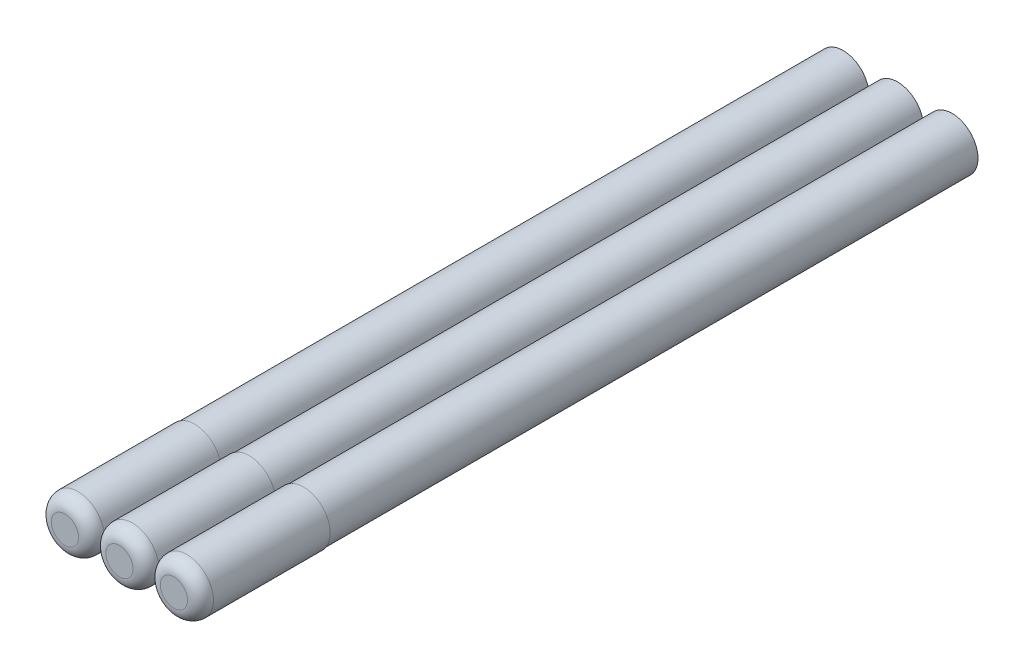
ISO-10303-21;
HEADER;
FILE_DESCRIPTION(('STEP AP214'),'2;1');
FILE_NAME('part.step','',(''),(''),'','','');
FILE_SCHEMA(('AUTOMOTIVE_DESIGN { 1 0 10303 214 1 1 1 1 }'));
ENDSEC;
DATA;
#1=APPLICATION_CONTEXT('core data for automotive mechanical design processes');
#2=APPLICATION_PROTOCOL_DEFINITION('international standard','automotive_design',2000,#1);
#3=PRODUCT_CONTEXT('',#1,'mechanical');
#4=PRODUCT('Part','Part','',(#3));
#5=PRODUCT_RELATED_PRODUCT_CATEGORY('part','',(#4));
#6=PRODUCT_DEFINITION_FORMATION('','',#4);
#7=PRODUCT_DEFINITION_CONTEXT('part definition',#1,'design');
#8=PRODUCT_DEFINITION('design','',#6,#7);
#9=PRODUCT_DEFINITION_SHAPE('','',#8);
#10=(LENGTH_UNIT() NAMED_UNIT(*) SI_UNIT(.MILLI.,.METRE.));
#11=(NAMED_UNIT(*) PLANE_ANGLE_UNIT() SI_UNIT($,.RADIAN.));
#12=(NAMED_UNIT(*) SI_UNIT($,.STERADIAN.) SOLID_ANGLE_UNIT());
#13=UNCERTAINTY_MEASURE_WITH_UNIT(LENGTH_MEASURE(1.E-05),#10,'distance_accuracy_value','');
#14=(GEOMETRIC_REPRESENTATION_CONTEXT(3) GLOBAL_UNCERTAINTY_ASSIGNED_CONTEXT((#13)) GLOBAL_UNIT_ASSIGNED_CONTEXT((#10,
#11,#12)) REPRESENTATION_CONTEXT('',''));
#15=CARTESIAN_POINT('',(0.,0.,0.));
#16=DIRECTION('',(0.,0.,1.));
#17=DIRECTION('',(1.,0.,0.));
#18=AXIS2_PLACEMENT_3D('',#15,#16,#17);
#19=CARTESIAN_POINT('',(-4.2,0.,60.));
#20=DIRECTION('',(0.,0.,-1.));
#21=DIRECTION('',(-1.,0.,0.));
#22=AXIS2_PLACEMENT_3D('',#19,#20,#21);
#23=CYLINDRICAL_SURFACE('',#22,2.05);
#24=CARTESIAN_POINT('',(-4.2,0.,59.));
#25=DIRECTION('',(0.,0.,1.));
#26=DIRECTION('',(1.,0.,0.));
#27=AXIS2_PLACEMENT_3D('',#24,#25,#26);
#28=CIRCLE('',#27,2.05);
#29=CARTESIAN_POINT('',(-2.15,0.,59.));
#30=VERTEX_POINT('',#29);
#31=EDGE_CURVE('E11',#30,#30,#28,.F.);
#32=ORIENTED_EDGE('',*,*,#31,.T.);
#33=EDGE_LOOP('',(#32));
#34=FACE_BOUND('',#33,.T.);
#35=CARTESIAN_POINT('',(-4.2,0.,50.));
#36=DIRECTION('',(0.,0.,1.));
#37=DIRECTION('',(1.,0.,0.));
#38=AXIS2_PLACEMENT_3D('',#35,#36,#37);
#39=CIRCLE('',#38,2.05);
#40=CARTESIAN_POINT('',(-2.15,0.,50.));
#41=VERTEX_POINT('',#40);
#42=EDGE_CURVE('E53',#41,#41,#39,.T.);
#43=ORIENTED_EDGE('',*,*,#42,.T.);
#44=EDGE_LOOP('',(#43));
#45=FACE_BOUND('',#44,.T.);
#46=ADVANCED_FACE('F42',(#34,#45),#23,.T.);
#47=CARTESIAN_POINT('',(-4.2,0.,60.));
#48=DIRECTION('',(0.,0.,1.));
#49=DIRECTION('',(1.,0.,0.));
#50=AXIS2_PLACEMENT_3D('',#47,#48,#49);
#51=PLANE('',#50);
#52=CARTESIAN_POINT('',(-4.2,0.,60.));
#53=DIRECTION('',(0.,0.,1.));
#54=DIRECTION('',(1.,0.,0.));
#55=AXIS2_PLACEMENT_3D('',#52,#53,#54);
#56=CIRCLE('',#55,1.05);
#57=CARTESIAN_POINT('',(-3.15,0.,60.));
#58=VERTEX_POINT('',#57);
#59=EDGE_CURVE('E49',#58,#58,#56,.T.);
#60=ORIENTED_EDGE('',*,*,#59,.T.);
#61=EDGE_LOOP('',(#60));
#62=FACE_BOUND('',#61,.T.);
#63=ADVANCED_FACE('F63',(#62),#51,.T.);
#64=CARTESIAN_POINT('',(-4.2,0.,50.));
#65=DIRECTION('',(0.,0.,1.));
#66=DIRECTION('',(1.,0.,0.));
#67=AXIS2_PLACEMENT_3D('',#64,#65,#66);
#68=PLANE('',#67);
#69=ORIENTED_EDGE('',*,*,#42,.F.);
#70=EDGE_LOOP('',(#69));
#71=FACE_BOUND('',#70,.T.);
#72=ADVANCED_FACE('F61',(#71),#68,.F.);
#73=CARTESIAN_POINT('',(-4.2,0.,59.));
#74=DIRECTION('',(0.,0.,1.));
#75=DIRECTION('',(1.,0.,0.));
#76=AXIS2_PLACEMENT_3D('',#73,#74,#75);
#77=TOROIDAL_SURFACE('',#76,1.05,1.);
#78=ORIENTED_EDGE('',*,*,#31,.F.);
#79=EDGE_LOOP('',(#78));
#80=FACE_BOUND('',#79,.T.);
#81=ORIENTED_EDGE('',*,*,#59,.F.);
#82=EDGE_LOOP('',(#81));
#83=FACE_BOUND('',#82,.T.);
#84=ADVANCED_FACE('F44',(#80,#83),#77,.T.);
#85=CLOSED_SHELL('',(#46,#63,#72,#84));
#86=MANIFOLD_SOLID_BREP('B2',#85);
#87=CARTESIAN_POINT('',(4.2,0.,60.));
#88=DIRECTION('',(0.,0.,-1.));
#89=DIRECTION('',(-1.,0.,0.));
#90=AXIS2_PLACEMENT_3D('',#87,#88,#89);
#91=CYLINDRICAL_SURFACE('',#90,2.05);
#92=CARTESIAN_POINT('',(4.2,0.,59.));
#93=DIRECTION('',(0.,0.,1.));
#94=DIRECTION('',(1.,0.,0.));
#95=AXIS2_PLACEMENT_3D('',#92,#93,#94);
#96=CIRCLE('',#95,2.05);
#97=CARTESIAN_POINT('',(6.25,0.,59.));
#98=VERTEX_POINT('',#97);
#99=EDGE_CURVE('E41',#98,#98,#96,.F.);
#100=ORIENTED_EDGE('',*,*,#99,.T.);
#101=EDGE_LOOP('',(#100));
#102=FACE_BOUND('',#101,.T.);
#103=CARTESIAN_POINT('',(4.2,0.,50.));
#104=DIRECTION('',(0.,0.,1.));
#105=DIRECTION('',(1.,0.,0.));
#106=AXIS2_PLACEMENT_3D('',#103,#104,#105);
#107=CIRCLE('',#106,2.05);
#108=CARTESIAN_POINT('',(6.25,0.,50.));
#109=VERTEX_POINT('',#108);
#110=EDGE_CURVE('E117',#109,#109,#107,.T.);
#111=ORIENTED_EDGE('',*,*,#110,.T.);
#112=EDGE_LOOP('',(#111));
#113=FACE_BOUND('',#112,.T.);
#114=ADVANCED_FACE('F106',(#102,#113),#91,.T.);
#115=CARTESIAN_POINT('',(4.2,0.,60.));
#116=DIRECTION('',(0.,0.,1.));
#117=DIRECTION('',(1.,0.,0.));
#118=AXIS2_PLACEMENT_3D('',#115,#116,#117);
#119=PLANE('',#118);
#120=CARTESIAN_POINT('',(4.2,0.,60.));
#121=DIRECTION('',(0.,0.,1.));
#122=DIRECTION('',(1.,0.,0.));
#123=AXIS2_PLACEMENT_3D('',#120,#121,#122);
#124=CIRCLE('',#123,1.05);
#125=CARTESIAN_POINT('',(5.25,0.,60.));
#126=VERTEX_POINT('',#125);
#127=EDGE_CURVE('E113',#126,#126,#124,.T.);
#128=ORIENTED_EDGE('',*,*,#127,.T.);
#129=EDGE_LOOP('',(#128));
#130=FACE_BOUND('',#129,.T.);
#131=ADVANCED_FACE('F127',(#130),#119,.T.);
#132=CARTESIAN_POINT('',(4.2,0.,50.));
#133=DIRECTION('',(0.,0.,1.));
#134=DIRECTION('',(1.,0.,0.));
#135=AXIS2_PLACEMENT_3D('',#132,#133,#134);
#136=PLANE('',#135);
#137=ORIENTED_EDGE('',*,*,#110,.F.);
#138=EDGE_LOOP('',(#137));
#139=FACE_BOUND('',#138,.T.);
#140=ADVANCED_FACE('F125',(#139),#136,.F.);
#141=CARTESIAN_POINT('',(4.2,0.,59.));
#142=DIRECTION('',(0.,0.,1.));
#143=DIRECTION('',(1.,0.,0.));
#144=AXIS2_PLACEMENT_3D('',#141,#142,#143);
#145=TOROIDAL_SURFACE('',#144,1.05,1.);
#146=ORIENTED_EDGE('',*,*,#99,.F.);
#147=EDGE_LOOP('',(#146));
#148=FACE_BOUND('',#147,.T.);
#149=ORIENTED_EDGE('',*,*,#127,.F.);
#150=EDGE_LOOP('',(#149));
#151=FACE_BOUND('',#150,.T.);
#152=ADVANCED_FACE('F108',(#148,#151),#145,.T.);
#153=CLOSED_SHELL('',(#114,#131,#140,#152));
#154=MANIFOLD_SOLID_BREP('B6',#153);
#155=CARTESIAN_POINT('',(0.,0.,60.));
#156=DIRECTION('',(0.,0.,-1.));
#157=DIRECTION('',(-1.,0.,0.));
#158=AXIS2_PLACEMENT_3D('',#155,#156,#157);
#159=CYLINDRICAL_SURFACE('',#158,2.05);
#160=CARTESIAN_POINT('',(0.,0.,59.));
#161=DIRECTION('',(0.,0.,1.));
#162=DIRECTION('',(1.,0.,0.));
#163=AXIS2_PLACEMENT_3D('',#160,#161,#162);
#164=CIRCLE('',#163,2.05);
#165=CARTESIAN_POINT('',(2.05,0.,59.));
#166=VERTEX_POINT('',#165);
#167=EDGE_CURVE('E105',#166,#166,#164,.F.);
#168=ORIENTED_EDGE('',*,*,#167,.T.);
#169=EDGE_LOOP('',(#168));
#170=FACE_BOUND('',#169,.T.);
#171=CARTESIAN_POINT('',(0.,0.,50.));
#172=DIRECTION('',(0.,0.,1.));
#173=DIRECTION('',(1.,0.,0.));
#174=AXIS2_PLACEMENT_3D('',#171,#172,#173);
#175=CIRCLE('',#174,2.05);
#176=CARTESIAN_POINT('',(2.05,0.,50.));
#177=VERTEX_POINT('',#176);
#178=EDGE_CURVE('E181',#177,#177,#175,.T.);
#179=ORIENTED_EDGE('',*,*,#178,.T.);
#180=EDGE_LOOP('',(#179));
#181=FACE_BOUND('',#180,.T.);
#182=ADVANCED_FACE('F170',(#170,#181),#159,.T.);
#183=CARTESIAN_POINT('',(0.,0.,60.));
#184=DIRECTION('',(0.,0.,1.));
#185=DIRECTION('',(1.,0.,0.));
#186=AXIS2_PLACEMENT_3D('',#183,#184,#185);
#187=PLANE('',#186);
#188=CARTESIAN_POINT('',(0.,0.,60.));
#189=DIRECTION('',(0.,0.,1.));
#190=DIRECTION('',(1.,0.,0.));
#191=AXIS2_PLACEMENT_3D('',#188,#189,#190);
#192=CIRCLE('',#191,1.05);
#193=CARTESIAN_POINT('',(1.05,0.,60.));
#194=VERTEX_POINT('',#193);
#195=EDGE_CURVE('E177',#194,#194,#192,.T.);
#196=ORIENTED_EDGE('',*,*,#195,.T.);
#197=EDGE_LOOP('',(#196));
#198=FACE_BOUND('',#197,.T.);
#199=ADVANCED_FACE('F191',(#198),#187,.T.);
#200=CARTESIAN_POINT('',(0.,0.,50.));
#201=DIRECTION('',(0.,0.,1.));
#202=DIRECTION('',(1.,0.,0.));
#203=AXIS2_PLACEMENT_3D('',#200,#201,#202);
#204=PLANE('',#203);
#205=ORIENTED_EDGE('',*,*,#178,.F.);
#206=EDGE_LOOP('',(#205));
#207=FACE_BOUND('',#206,.T.);
#208=ADVANCED_FACE('F189',(#207),#204,.F.);
#209=CARTESIAN_POINT('',(0.,0.,59.));
#210=DIRECTION('',(0.,0.,1.));
#211=DIRECTION('',(1.,0.,0.));
#212=AXIS2_PLACEMENT_3D('',#209,#210,#211);
#213=TOROIDAL_SURFACE('',#212,1.05,1.);
#214=ORIENTED_EDGE('',*,*,#167,.F.);
#215=EDGE_LOOP('',(#214));
#216=FACE_BOUND('',#215,.T.);
#217=ORIENTED_EDGE('',*,*,#195,.F.);
#218=EDGE_LOOP('',(#217));
#219=FACE_BOUND('',#218,.T.);
#220=ADVANCED_FACE('F172',(#216,#219),#213,.T.);
#221=CLOSED_SHELL('',(#182,#199,#208,#220));
#222=MANIFOLD_SOLID_BREP('B36',#221);
#223=CARTESIAN_POINT('',(-4.2,0.,50.));
#224=DIRECTION('',(0.,0.,-1.));
#225=DIRECTION('',(-1.,0.,0.));
#226=AXIS2_PLACEMENT_3D('',#223,#224,#225);
#227=CYLINDRICAL_SURFACE('',#226,2.);
#228=CARTESIAN_POINT('',(-4.2,0.,50.));
#229=DIRECTION('',(0.,0.,1.));
#230=DIRECTION('',(1.,0.,0.));
#231=AXIS2_PLACEMENT_3D('',#228,#229,#230);
#232=CIRCLE('',#231,2.);
#233=CARTESIAN_POINT('',(-2.2,0.,50.));
#234=VERTEX_POINT('',#233);
#235=EDGE_CURVE('E169',#234,#234,#232,.T.);
#236=ORIENTED_EDGE('',*,*,#235,.F.);
#237=EDGE_LOOP('',(#236));
#238=FACE_BOUND('',#237,.T.);
#239=CARTESIAN_POINT('',(-4.2,0.,0.));
#240=DIRECTION('',(0.,0.,1.));
#241=DIRECTION('',(1.,0.,0.));
#242=AXIS2_PLACEMENT_3D('',#239,#240,#241);
#243=CIRCLE('',#242,2.);
#244=CARTESIAN_POINT('',(-2.2,0.,0.));
#245=VERTEX_POINT('',#244);
#246=EDGE_CURVE('E237',#245,#245,#243,.T.);
#247=ORIENTED_EDGE('',*,*,#246,.T.);
#248=EDGE_LOOP('',(#247));
#249=FACE_BOUND('',#248,.T.);
#250=ADVANCED_FACE('F234',(#238,#249),#227,.T.);
#251=CARTESIAN_POINT('',(-4.2,0.,50.));
#252=DIRECTION('',(0.,0.,1.));
#253=DIRECTION('',(1.,0.,0.));
#254=AXIS2_PLACEMENT_3D('',#251,#252,#253);
#255=PLANE('',#254);
#256=ORIENTED_EDGE('',*,*,#235,.T.);
#257=EDGE_LOOP('',(#256));
#258=FACE_BOUND('',#257,.T.);
#259=ADVANCED_FACE('F249',(#258),#255,.T.);
#260=CARTESIAN_POINT('',(-4.2,0.,0.));
#261=DIRECTION('',(0.,0.,1.));
#262=DIRECTION('',(1.,0.,0.));
#263=AXIS2_PLACEMENT_3D('',#260,#261,#262);
#264=PLANE('',#263);
#265=ORIENTED_EDGE('',*,*,#246,.F.);
#266=EDGE_LOOP('',(#265));
#267=FACE_BOUND('',#266,.T.);
#268=ADVANCED_FACE('F247',(#267),#264,.F.);
#269=CLOSED_SHELL('',(#250,#259,#268));
#270=MANIFOLD_SOLID_BREP('B100',#269);
#271=CARTESIAN_POINT('',(4.2,0.,50.));
#272=DIRECTION('',(0.,0.,-1.));
#273=DIRECTION('',(-1.,0.,0.));
#274=AXIS2_PLACEMENT_3D('',#271,#272,#273);
#275=CYLINDRICAL_SURFACE('',#274,2.);
#276=CARTESIAN_POINT('',(4.2,0.,50.));
#277=DIRECTION('',(0.,0.,1.));
#278=DIRECTION('',(1.,0.,0.));
#279=AXIS2_PLACEMENT_3D('',#276,#277,#278);
#280=CIRCLE('',#279,2.);
#281=CARTESIAN_POINT('',(6.2,0.,50.));
#282=VERTEX_POINT('',#281);
#283=EDGE_CURVE('E233',#282,#282,#280,.T.);
#284=ORIENTED_EDGE('',*,*,#283,.F.);
#285=EDGE_LOOP('',(#284));
#286=FACE_BOUND('',#285,.T.);
#287=CARTESIAN_POINT('',(4.2,0.,0.));
#288=DIRECTION('',(0.,0.,1.));
#289=DIRECTION('',(1.,0.,0.));
#290=AXIS2_PLACEMENT_3D('',#287,#288,#289);
#291=CIRCLE('',#290,2.);
#292=CARTESIAN_POINT('',(6.2,0.,0.));
#293=VERTEX_POINT('',#292);
#294=EDGE_CURVE('E285',#293,#293,#291,.T.);
#295=ORIENTED_EDGE('',*,*,#294,.T.);
#296=EDGE_LOOP('',(#295));
#297=FACE_BOUND('',#296,.T.);
#298=ADVANCED_FACE('F282',(#286,#297),#275,.T.);
#299=CARTESIAN_POINT('',(4.2,0.,50.));
#300=DIRECTION('',(0.,0.,1.));
#301=DIRECTION('',(1.,0.,0.));
#302=AXIS2_PLACEMENT_3D('',#299,#300,#301);
#303=PLANE('',#302);
#304=ORIENTED_EDGE('',*,*,#283,.T.);
#305=EDGE_LOOP('',(#304));
#306=FACE_BOUND('',#305,.T.);
#307=ADVANCED_FACE('F297',(#306),#303,.T.);
#308=CARTESIAN_POINT('',(4.2,0.,0.));
#309=DIRECTION('',(0.,0.,1.));
#310=DIRECTION('',(1.,0.,0.));
#311=AXIS2_PLACEMENT_3D('',#308,#309,#310);
#312=PLANE('',#311);
#313=ORIENTED_EDGE('',*,*,#294,.F.);
#314=EDGE_LOOP('',(#313));
#315=FACE_BOUND('',#314,.T.);
#316=ADVANCED_FACE('F295',(#315),#312,.F.);
#317=CLOSED_SHELL('',(#298,#307,#316));
#318=MANIFOLD_SOLID_BREP('B164',#317);
#319=CARTESIAN_POINT('',(0.,0.,50.));
#320=DIRECTION('',(0.,0.,-1.));
#321=DIRECTION('',(-1.,0.,0.));
#322=AXIS2_PLACEMENT_3D('',#319,#320,#321);
#323=CYLINDRICAL_SURFACE('',#322,2.);
#324=CARTESIAN_POINT('',(0.,0.,50.));
#325=DIRECTION('',(0.,0.,1.));
#326=DIRECTION('',(1.,0.,0.));
#327=AXIS2_PLACEMENT_3D('',#324,#325,#326);
#328=CIRCLE('',#327,2.);
#329=CARTESIAN_POINT('',(2.,0.,50.));
#330=VERTEX_POINT('',#329);
#331=EDGE_CURVE('E281',#330,#330,#328,.T.);
#332=ORIENTED_EDGE('',*,*,#331,.F.);
#333=EDGE_LOOP('',(#332));
#334=FACE_BOUND('',#333,.T.);
#335=CARTESIAN_POINT('',(0.,0.,0.));
#336=DIRECTION('',(0.,0.,1.));
#337=DIRECTION('',(1.,0.,0.));
#338=AXIS2_PLACEMENT_3D('',#335,#336,#337);
#339=CIRCLE('',#338,2.);
#340=CARTESIAN_POINT('',(2.,0.,0.));
#341=VERTEX_POINT('',#340);
#342=EDGE_CURVE('E326',#341,#341,#339,.T.);
#343=ORIENTED_EDGE('',*,*,#342,.T.);
#344=EDGE_LOOP('',(#343));
#345=FACE_BOUND('',#344,.T.);
#346=ADVANCED_FACE('F323',(#334,#345),#323,.T.);
#347=CARTESIAN_POINT('',(0.,0.,50.));
#348=DIRECTION('',(0.,0.,1.));
#349=DIRECTION('',(1.,0.,0.));
#350=AXIS2_PLACEMENT_3D('',#347,#348,#349);
#351=PLANE('',#350);
#352=ORIENTED_EDGE('',*,*,#331,.T.);
#353=EDGE_LOOP('',(#352));
#354=FACE_BOUND('',#353,.T.);
#355=ADVANCED_FACE('F338',(#354),#351,.T.);
#356=CARTESIAN_POINT('',(0.,0.,0.));
#357=DIRECTION('',(0.,0.,1.));
#358=DIRECTION('',(1.,0.,0.));
#359=AXIS2_PLACEMENT_3D('',#356,#357,#358);
#360=PLANE('',#359);
#361=ORIENTED_EDGE('',*,*,#342,.F.);
#362=EDGE_LOOP('',(#361));
#363=FACE_BOUND('',#362,.T.);
#364=ADVANCED_FACE('F336',(#363),#360,.F.);
#365=CLOSED_SHELL('',(#346,#355,#364));
#366=MANIFOLD_SOLID_BREP('B228',#365);
#367=ADVANCED_BREP_SHAPE_REPRESENTATION('',(#18,#86,#154,#222,#270,#318,#366),#14);
#368=SHAPE_DEFINITION_REPRESENTATION(#9,#367);
ENDSEC;
END-ISO-10303-21;
